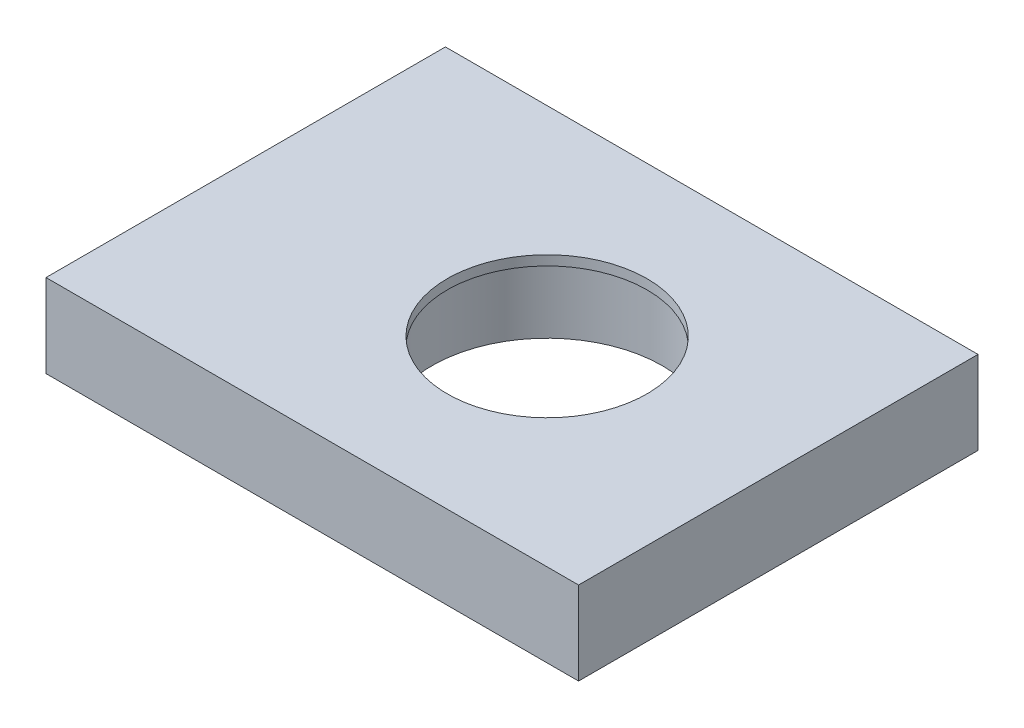
ISO-10303-21;
HEADER;
FILE_DESCRIPTION(('STEP AP214'),'2;1');
FILE_NAME('part.step','',(''),(''),'','','');
FILE_SCHEMA(('AUTOMOTIVE_DESIGN { 1 0 10303 214 1 1 1 1 }'));
ENDSEC;
DATA;
#1=APPLICATION_CONTEXT('core data for automotive mechanical design processes');
#2=APPLICATION_PROTOCOL_DEFINITION('international standard','automotive_design',2000,#1);
#3=PRODUCT_CONTEXT('',#1,'mechanical');
#4=PRODUCT('Part','Part','',(#3));
#5=PRODUCT_RELATED_PRODUCT_CATEGORY('part','',(#4));
#6=PRODUCT_DEFINITION_FORMATION('','',#4);
#7=PRODUCT_DEFINITION_CONTEXT('part definition',#1,'design');
#8=PRODUCT_DEFINITION('design','',#6,#7);
#9=PRODUCT_DEFINITION_SHAPE('','',#8);
#10=(LENGTH_UNIT() NAMED_UNIT(*) SI_UNIT(.MILLI.,.METRE.));
#11=(NAMED_UNIT(*) PLANE_ANGLE_UNIT() SI_UNIT($,.RADIAN.));
#12=(NAMED_UNIT(*) SI_UNIT($,.STERADIAN.) SOLID_ANGLE_UNIT());
#13=UNCERTAINTY_MEASURE_WITH_UNIT(LENGTH_MEASURE(1.E-05),#10,'distance_accuracy_value','');
#14=(GEOMETRIC_REPRESENTATION_CONTEXT(3) GLOBAL_UNCERTAINTY_ASSIGNED_CONTEXT((#13)) GLOBAL_UNIT_ASSIGNED_CONTEXT((#10,
#11,#12)) REPRESENTATION_CONTEXT('',''));
#15=CARTESIAN_POINT('',(0.,0.,0.));
#16=DIRECTION('',(0.,0.,1.));
#17=DIRECTION('',(1.,0.,0.));
#18=AXIS2_PLACEMENT_3D('',#15,#16,#17);
#19=CARTESIAN_POINT('',(3.35279999999999,7.9375,0.));
#20=DIRECTION('',(0.,-1.,0.));
#21=DIRECTION('',(0.,0.,-1.));
#22=AXIS2_PLACEMENT_3D('',#19,#20,#21);
#23=CYLINDRICAL_SURFACE('',#22,9.525);
#24=CARTESIAN_POINT('',(3.35279999999999,7.9375,0.));
#25=DIRECTION('',(0.,-1.,0.));
#26=DIRECTION('',(0.,0.,-1.));
#27=AXIS2_PLACEMENT_3D('',#24,#25,#26);
#28=CIRCLE('',#27,9.525);
#29=CARTESIAN_POINT('',(3.35279999999999,7.9375,-9.525));
#30=VERTEX_POINT('',#29);
#31=EDGE_CURVE('E120',#30,#30,#28,.T.);
#32=ORIENTED_EDGE('',*,*,#31,.F.);
#33=EDGE_LOOP('',(#32));
#34=FACE_BOUND('',#33,.T.);
#35=CARTESIAN_POINT('',(3.35279999999999,7.0104,0.));
#36=DIRECTION('',(0.,-1.,0.));
#37=DIRECTION('',(0.,0.,-1.));
#38=AXIS2_PLACEMENT_3D('',#35,#36,#37);
#39=CIRCLE('',#38,9.525);
#40=CARTESIAN_POINT('',(3.35279999999999,7.0104,-9.525));
#41=VERTEX_POINT('',#40);
#42=EDGE_CURVE('E49',#41,#41,#39,.F.);
#43=ORIENTED_EDGE('',*,*,#42,.F.);
#44=EDGE_LOOP('',(#43));
#45=FACE_BOUND('',#44,.T.);
#46=ADVANCED_FACE('F45',(#34,#45),#23,.F.);
#47=CARTESIAN_POINT('',(25.4,7.9375,19.05));
#48=DIRECTION('',(-1.,0.,0.));
#49=DIRECTION('',(0.,0.,1.));
#50=AXIS2_PLACEMENT_3D('',#47,#48,#49);
#51=PLANE('',#50);
#52=DIRECTION('',(0.,0.,-1.));
#53=VECTOR('',#52,1.);
#54=CARTESIAN_POINT('',(25.4,0.,19.05));
#55=LINE('',#54,#53);
#56=CARTESIAN_POINT('',(25.4,0.,19.05));
#57=VERTEX_POINT('',#56);
#58=CARTESIAN_POINT('',(25.4,0.,-19.05));
#59=VERTEX_POINT('',#58);
#60=EDGE_CURVE('E116',#57,#59,#55,.T.);
#61=ORIENTED_EDGE('',*,*,#60,.T.);
#62=DIRECTION('',(0.,-1.,0.));
#63=VECTOR('',#62,1.);
#64=CARTESIAN_POINT('',(25.4,7.9375,-19.05));
#65=LINE('',#64,#63);
#66=CARTESIAN_POINT('',(25.4,7.9375,-19.05));
#67=VERTEX_POINT('',#66);
#68=EDGE_CURVE('E11',#67,#59,#65,.T.);
#69=ORIENTED_EDGE('',*,*,#68,.F.);
#70=DIRECTION('',(0.,0.,-1.));
#71=VECTOR('',#70,1.);
#72=CARTESIAN_POINT('',(25.4,7.9375,19.05));
#73=LINE('',#72,#71);
#74=CARTESIAN_POINT('',(25.4,7.9375,19.05));
#75=VERTEX_POINT('',#74);
#76=EDGE_CURVE('E99',#75,#67,#73,.T.);
#77=ORIENTED_EDGE('',*,*,#76,.F.);
#78=DIRECTION('',(0.,-1.,0.));
#79=VECTOR('',#78,1.);
#80=CARTESIAN_POINT('',(25.4,7.9375,19.05));
#81=LINE('',#80,#79);
#82=EDGE_CURVE('E112',#75,#57,#81,.T.);
#83=ORIENTED_EDGE('',*,*,#82,.T.);
#84=EDGE_LOOP('',(#61,#69,#77,#83));
#85=FACE_BOUND('',#84,.T.);
#86=ADVANCED_FACE('F47',(#85),#51,.F.);
#87=CARTESIAN_POINT('',(-25.4,7.9375,-19.05));
#88=DIRECTION('',(0.,0.,1.));
#89=DIRECTION('',(1.,0.,0.));
#90=AXIS2_PLACEMENT_3D('',#87,#88,#89);
#91=PLANE('',#90);
#92=DIRECTION('',(-1.,0.,0.));
#93=VECTOR('',#92,1.);
#94=CARTESIAN_POINT('',(-25.4,0.,-19.05));
#95=LINE('',#94,#93);
#96=CARTESIAN_POINT('',(-25.4,0.,-19.05));
#97=VERTEX_POINT('',#96);
#98=EDGE_CURVE('E104',#59,#97,#95,.T.);
#99=ORIENTED_EDGE('',*,*,#98,.T.);
#100=DIRECTION('',(0.,-1.,0.));
#101=VECTOR('',#100,1.);
#102=CARTESIAN_POINT('',(-25.4,7.9375,-19.05));
#103=LINE('',#102,#101);
#104=CARTESIAN_POINT('',(-25.4,7.9375,-19.05));
#105=VERTEX_POINT('',#104);
#106=EDGE_CURVE('E56',#105,#97,#103,.T.);
#107=ORIENTED_EDGE('',*,*,#106,.F.);
#108=DIRECTION('',(-1.,0.,0.));
#109=VECTOR('',#108,1.);
#110=CARTESIAN_POINT('',(-25.4,7.9375,-19.05));
#111=LINE('',#110,#109);
#112=EDGE_CURVE('E94',#67,#105,#111,.T.);
#113=ORIENTED_EDGE('',*,*,#112,.F.);
#114=ORIENTED_EDGE('',*,*,#68,.T.);
#115=EDGE_LOOP('',(#99,#107,#113,#114));
#116=FACE_BOUND('',#115,.T.);
#117=ADVANCED_FACE('F103',(#116),#91,.F.);
#118=CARTESIAN_POINT('',(-25.4,7.9375,19.05));
#119=DIRECTION('',(1.,0.,0.));
#120=DIRECTION('',(0.,0.,-1.));
#121=AXIS2_PLACEMENT_3D('',#118,#119,#120);
#122=PLANE('',#121);
#123=DIRECTION('',(0.,0.,1.));
#124=VECTOR('',#123,1.);
#125=CARTESIAN_POINT('',(-25.4,0.,19.05));
#126=LINE('',#125,#124);
#127=CARTESIAN_POINT('',(-25.4,0.,19.05));
#128=VERTEX_POINT('',#127);
#129=EDGE_CURVE('E81',#97,#128,#126,.T.);
#130=ORIENTED_EDGE('',*,*,#129,.T.);
#131=DIRECTION('',(0.,-1.,0.));
#132=VECTOR('',#131,1.);
#133=CARTESIAN_POINT('',(-25.4,7.9375,19.05));
#134=LINE('',#133,#132);
#135=CARTESIAN_POINT('',(-25.4,7.9375,19.05));
#136=VERTEX_POINT('',#135);
#137=EDGE_CURVE('E106',#136,#128,#134,.T.);
#138=ORIENTED_EDGE('',*,*,#137,.F.);
#139=DIRECTION('',(0.,0.,1.));
#140=VECTOR('',#139,1.);
#141=CARTESIAN_POINT('',(-25.4,7.9375,19.05));
#142=LINE('',#141,#140);
#143=EDGE_CURVE('E97',#105,#136,#142,.T.);
#144=ORIENTED_EDGE('',*,*,#143,.F.);
#145=ORIENTED_EDGE('',*,*,#106,.T.);
#146=EDGE_LOOP('',(#130,#138,#144,#145));
#147=FACE_BOUND('',#146,.T.);
#148=ADVANCED_FACE('F108',(#147),#122,.F.);
#149=CARTESIAN_POINT('',(-25.4,7.9375,19.05));
#150=DIRECTION('',(0.,0.,-1.));
#151=DIRECTION('',(-1.,0.,0.));
#152=AXIS2_PLACEMENT_3D('',#149,#150,#151);
#153=PLANE('',#152);
#154=DIRECTION('',(1.,0.,0.));
#155=VECTOR('',#154,1.);
#156=CARTESIAN_POINT('',(-25.4,0.,19.05));
#157=LINE('',#156,#155);
#158=EDGE_CURVE('E87',#128,#57,#157,.T.);
#159=ORIENTED_EDGE('',*,*,#158,.T.);
#160=ORIENTED_EDGE('',*,*,#82,.F.);
#161=DIRECTION('',(1.,0.,0.));
#162=VECTOR('',#161,1.);
#163=CARTESIAN_POINT('',(-25.4,7.9375,19.05));
#164=LINE('',#163,#162);
#165=EDGE_CURVE('E64',#136,#75,#164,.T.);
#166=ORIENTED_EDGE('',*,*,#165,.F.);
#167=ORIENTED_EDGE('',*,*,#137,.T.);
#168=EDGE_LOOP('',(#159,#160,#166,#167));
#169=FACE_BOUND('',#168,.T.);
#170=ADVANCED_FACE('F130',(#169),#153,.F.);
#171=CARTESIAN_POINT('',(0.,7.9375,0.));
#172=DIRECTION('',(0.,-1.,0.));
#173=DIRECTION('',(0.,0.,-1.));
#174=AXIS2_PLACEMENT_3D('',#171,#172,#173);
#175=PLANE('',#174);
#176=ORIENTED_EDGE('',*,*,#31,.T.);
#177=EDGE_LOOP('',(#176));
#178=FACE_BOUND('',#177,.T.);
#179=ORIENTED_EDGE('',*,*,#76,.T.);
#180=ORIENTED_EDGE('',*,*,#112,.T.);
#181=ORIENTED_EDGE('',*,*,#143,.T.);
#182=ORIENTED_EDGE('',*,*,#165,.T.);
#183=EDGE_LOOP('',(#179,#180,#181,#182));
#184=FACE_BOUND('',#183,.T.);
#185=ADVANCED_FACE('F95',(#178,#184),#175,.F.);
#186=CARTESIAN_POINT('',(0.,0.,0.));
#187=DIRECTION('',(0.,-1.,0.));
#188=DIRECTION('',(0.,0.,-1.));
#189=AXIS2_PLACEMENT_3D('',#186,#187,#188);
#190=PLANE('',#189);
#191=CARTESIAN_POINT('',(-21.4249,0.,14.986));
#192=DIRECTION('',(0.,-1.,0.));
#193=DIRECTION('',(0.,0.,-1.));
#194=AXIS2_PLACEMENT_3D('',#191,#192,#193);
#195=CIRCLE('',#194,1.4986);
#196=CARTESIAN_POINT('',(-21.4249,0.,13.4874));
#197=VERTEX_POINT('',#196);
#198=EDGE_CURVE('E166',#197,#197,#195,.T.);
#199=ORIENTED_EDGE('',*,*,#198,.F.);
#200=EDGE_LOOP('',(#199));
#201=FACE_BOUND('',#200,.T.);
#202=CARTESIAN_POINT('',(-21.4249,0.,-4.99533333333333));
#203=DIRECTION('',(0.,-1.,0.));
#204=DIRECTION('',(0.,0.,-1.));
#205=AXIS2_PLACEMENT_3D('',#202,#203,#204);
#206=CIRCLE('',#205,1.4986);
#207=CARTESIAN_POINT('',(-21.4249,0.,-6.49393333333333));
#208=VERTEX_POINT('',#207);
#209=EDGE_CURVE('E154',#208,#208,#206,.T.);
#210=ORIENTED_EDGE('',*,*,#209,.F.);
#211=EDGE_LOOP('',(#210));
#212=FACE_BOUND('',#211,.T.);
#213=CARTESIAN_POINT('',(-21.4249,0.,-14.986));
#214=DIRECTION('',(0.,-1.,0.));
#215=DIRECTION('',(0.,0.,-1.));
#216=AXIS2_PLACEMENT_3D('',#213,#214,#215);
#217=CIRCLE('',#216,1.4986);
#218=CARTESIAN_POINT('',(-21.4249,0.,-16.4846));
#219=VERTEX_POINT('',#218);
#220=EDGE_CURVE('E153',#219,#219,#217,.T.);
#221=ORIENTED_EDGE('',*,*,#220,.F.);
#222=EDGE_LOOP('',(#221));
#223=FACE_BOUND('',#222,.T.);
#224=CARTESIAN_POINT('',(-21.4249,0.,4.99533333333334));
#225=DIRECTION('',(0.,-1.,0.));
#226=DIRECTION('',(0.,0.,-1.));
#227=AXIS2_PLACEMENT_3D('',#224,#225,#226);
#228=CIRCLE('',#227,1.4986);
#229=CARTESIAN_POINT('',(-21.4249,0.,3.49673333333334));
#230=VERTEX_POINT('',#229);
#231=EDGE_CURVE('E162',#230,#230,#228,.T.);
#232=ORIENTED_EDGE('',*,*,#231,.F.);
#233=EDGE_LOOP('',(#232));
#234=FACE_BOUND('',#233,.T.);
#235=CARTESIAN_POINT('',(3.35279999999999,0.,0.));
#236=DIRECTION('',(0.,-1.,0.));
#237=DIRECTION('',(0.,0.,-1.));
#238=AXIS2_PLACEMENT_3D('',#235,#236,#237);
#239=CIRCLE('',#238,10.9982);
#240=CARTESIAN_POINT('',(3.35279999999999,0.,-10.9982));
#241=VERTEX_POINT('',#240);
#242=EDGE_CURVE('E140',#241,#241,#239,.T.);
#243=ORIENTED_EDGE('',*,*,#242,.F.);
#244=EDGE_LOOP('',(#243));
#245=FACE_BOUND('',#244,.T.);
#246=ORIENTED_EDGE('',*,*,#60,.F.);
#247=ORIENTED_EDGE('',*,*,#158,.F.);
#248=ORIENTED_EDGE('',*,*,#129,.F.);
#249=ORIENTED_EDGE('',*,*,#98,.F.);
#250=EDGE_LOOP('',(#246,#247,#248,#249));
#251=FACE_BOUND('',#250,.T.);
#252=ADVANCED_FACE('F133',(#201,#212,#223,#234,#245,#251),#190,.T.);
#253=CARTESIAN_POINT('',(3.35279999999999,7.0104,0.));
#254=DIRECTION('',(0.,-1.,0.));
#255=DIRECTION('',(0.,0.,-1.));
#256=AXIS2_PLACEMENT_3D('',#253,#254,#255);
#257=PLANE('',#256);
#258=CARTESIAN_POINT('',(3.35279999999999,7.0104,0.));
#259=DIRECTION('',(0.,-1.,0.));
#260=DIRECTION('',(0.,0.,-1.));
#261=AXIS2_PLACEMENT_3D('',#258,#259,#260);
#262=CIRCLE('',#261,10.9982);
#263=CARTESIAN_POINT('',(3.35279999999999,7.0104,-10.9982));
#264=VERTEX_POINT('',#263);
#265=EDGE_CURVE('E144',#264,#264,#262,.T.);
#266=ORIENTED_EDGE('',*,*,#265,.T.);
#267=EDGE_LOOP('',(#266));
#268=FACE_BOUND('',#267,.T.);
#269=ORIENTED_EDGE('',*,*,#42,.T.);
#270=EDGE_LOOP('',(#269));
#271=FACE_BOUND('',#270,.T.);
#272=ADVANCED_FACE('F192',(#268,#271),#257,.T.);
#273=CARTESIAN_POINT('',(3.35279999999999,7.0104,0.));
#274=DIRECTION('',(0.,-1.,0.));
#275=DIRECTION('',(0.,0.,-1.));
#276=AXIS2_PLACEMENT_3D('',#273,#274,#275);
#277=CYLINDRICAL_SURFACE('',#276,10.9982);
#278=ORIENTED_EDGE('',*,*,#265,.F.);
#279=EDGE_LOOP('',(#278));
#280=FACE_BOUND('',#279,.T.);
#281=ORIENTED_EDGE('',*,*,#242,.T.);
#282=EDGE_LOOP('',(#281));
#283=FACE_BOUND('',#282,.T.);
#284=ADVANCED_FACE('F202',(#280,#283),#277,.F.);
#285=CARTESIAN_POINT('',(-21.4249,6.5,4.99533333333334));
#286=DIRECTION('',(0.,-1.,0.));
#287=DIRECTION('',(0.,0.,-1.));
#288=AXIS2_PLACEMENT_3D('',#285,#286,#287);
#289=CYLINDRICAL_SURFACE('',#288,1.4986);
#290=CARTESIAN_POINT('',(-21.4249,6.5,4.99533333333334));
#291=DIRECTION('',(0.,-1.,0.));
#292=DIRECTION('',(0.,0.,-1.));
#293=AXIS2_PLACEMENT_3D('',#290,#291,#292);
#294=CIRCLE('',#293,1.4986);
#295=CARTESIAN_POINT('',(-21.4249,6.5,3.49673333333334));
#296=VERTEX_POINT('',#295);
#297=EDGE_CURVE('E158',#296,#296,#294,.T.);
#298=CARTESIAN_POINT('',(-21.4249,6.5,3.49673333333334));
#299=CARTESIAN_POINT('',(-21.4249,6.43229166666667,3.49673333333334));
#300=CARTESIAN_POINT('',(-21.4249,6.36458333333333,3.49673333333334));
#301=CARTESIAN_POINT('',(-21.4249,6.22916666666667,3.49673333333334));
#302=CARTESIAN_POINT('',(-21.4249,6.16145833333333,3.49673333333334));
#303=CARTESIAN_POINT('',(-21.4249,6.02604166666667,3.49673333333334));
#304=CARTESIAN_POINT('',(-21.4249,5.95833333333333,3.49673333333334));
#305=CARTESIAN_POINT('',(-21.4249,5.82291666666667,3.49673333333334));
#306=CARTESIAN_POINT('',(-21.4249,5.75520833333333,3.49673333333334));
#307=CARTESIAN_POINT('',(-21.4249,5.61979166666667,3.49673333333334));
#308=CARTESIAN_POINT('',(-21.4249,5.55208333333333,3.49673333333334));
#309=CARTESIAN_POINT('',(-21.4249,5.41666666666667,3.49673333333334));
#310=CARTESIAN_POINT('',(-21.4249,5.34895833333333,3.49673333333334));
#311=CARTESIAN_POINT('',(-21.4249,5.21354166666667,3.49673333333334));
#312=CARTESIAN_POINT('',(-21.4249,5.14583333333333,3.49673333333334));
#313=CARTESIAN_POINT('',(-21.4249,5.01041666666667,3.49673333333334));
#314=CARTESIAN_POINT('',(-21.4249,4.94270833333333,3.49673333333334));
#315=CARTESIAN_POINT('',(-21.4249,4.80729166666667,3.49673333333334));
#316=CARTESIAN_POINT('',(-21.4249,4.73958333333333,3.49673333333334));
#317=CARTESIAN_POINT('',(-21.4249,4.60416666666667,3.49673333333334));
#318=CARTESIAN_POINT('',(-21.4249,4.53645833333333,3.49673333333334));
#319=CARTESIAN_POINT('',(-21.4249,4.40104166666667,3.49673333333334));
#320=CARTESIAN_POINT('',(-21.4249,4.33333333333333,3.49673333333334));
#321=CARTESIAN_POINT('',(-21.4249,4.19791666666667,3.49673333333334));
#322=CARTESIAN_POINT('',(-21.4249,4.13020833333333,3.49673333333334));
#323=CARTESIAN_POINT('',(-21.4249,3.99479166666667,3.49673333333334));
#324=CARTESIAN_POINT('',(-21.4249,3.92708333333333,3.49673333333334));
#325=CARTESIAN_POINT('',(-21.4249,3.79166666666667,3.49673333333334));
#326=CARTESIAN_POINT('',(-21.4249,3.72395833333333,3.49673333333334));
#327=CARTESIAN_POINT('',(-21.4249,3.58854166666667,3.49673333333334));
#328=CARTESIAN_POINT('',(-21.4249,3.52083333333333,3.49673333333334));
#329=CARTESIAN_POINT('',(-21.4249,3.38541666666667,3.49673333333334));
#330=CARTESIAN_POINT('',(-21.4249,3.31770833333333,3.49673333333334));
#331=CARTESIAN_POINT('',(-21.4249,3.18229166666667,3.49673333333334));
#332=CARTESIAN_POINT('',(-21.4249,3.11458333333333,3.49673333333334));
#333=CARTESIAN_POINT('',(-21.4249,2.97916666666667,3.49673333333334));
#334=CARTESIAN_POINT('',(-21.4249,2.91145833333333,3.49673333333334));
#335=CARTESIAN_POINT('',(-21.4249,2.77604166666667,3.49673333333334));
#336=CARTESIAN_POINT('',(-21.4249,2.70833333333333,3.49673333333334));
#337=CARTESIAN_POINT('',(-21.4249,2.57291666666667,3.49673333333334));
#338=CARTESIAN_POINT('',(-21.4249,2.50520833333333,3.49673333333334));
#339=CARTESIAN_POINT('',(-21.4249,2.36979166666667,3.49673333333334));
#340=CARTESIAN_POINT('',(-21.4249,2.30208333333333,3.49673333333334));
#341=CARTESIAN_POINT('',(-21.4249,2.16666666666667,3.49673333333334));
#342=CARTESIAN_POINT('',(-21.4249,2.09895833333333,3.49673333333334));
#343=CARTESIAN_POINT('',(-21.4249,1.96354166666667,3.49673333333334));
#344=CARTESIAN_POINT('',(-21.4249,1.89583333333333,3.49673333333334));
#345=CARTESIAN_POINT('',(-21.4249,1.76041666666667,3.49673333333334));
#346=CARTESIAN_POINT('',(-21.4249,1.69270833333333,3.49673333333334));
#347=CARTESIAN_POINT('',(-21.4249,1.55729166666667,3.49673333333334));
#348=CARTESIAN_POINT('',(-21.4249,1.48958333333333,3.49673333333334));
#349=CARTESIAN_POINT('',(-21.4249,1.35416666666667,3.49673333333334));
#350=CARTESIAN_POINT('',(-21.4249,1.28645833333333,3.49673333333334));
#351=CARTESIAN_POINT('',(-21.4249,1.15104166666667,3.49673333333334));
#352=CARTESIAN_POINT('',(-21.4249,1.08333333333333,3.49673333333334));
#353=CARTESIAN_POINT('',(-21.4249,0.947916666666667,3.49673333333334));
#354=CARTESIAN_POINT('',(-21.4249,0.880208333333333,3.49673333333334));
#355=CARTESIAN_POINT('',(-21.4249,0.744791666666667,3.49673333333334));
#356=CARTESIAN_POINT('',(-21.4249,0.677083333333334,3.49673333333334));
#357=CARTESIAN_POINT('',(-21.4249,0.541666666666667,3.49673333333334));
#358=CARTESIAN_POINT('',(-21.4249,0.473958333333334,3.49673333333334));
#359=CARTESIAN_POINT('',(-21.4249,0.338541666666667,3.49673333333334));
#360=CARTESIAN_POINT('',(-21.4249,0.270833333333334,3.49673333333334));
#361=CARTESIAN_POINT('',(-21.4249,0.135416666666667,3.49673333333334));
#362=CARTESIAN_POINT('',(-21.4249,0.0677083333333333,3.49673333333334));
#363=CARTESIAN_POINT('',(-21.4249,0.,3.49673333333334));
#364=B_SPLINE_CURVE_WITH_KNOTS('',3,(#298,#299,#300,#301,#302,#303,#304,#305,#306,#307,#308,
#309,#310,#311,#312,#313,#314,#315,#316,#317,#318,#319,#320,#321,#322,#323,#324,#325,#326,#327,
#328,#329,#330,#331,#332,#333,#334,#335,#336,#337,#338,#339,#340,#341,#342,#343,#344,#345,#346,
#347,#348,#349,#350,#351,#352,#353,#354,#355,#356,#357,#358,#359,#360,#361,#362,#363),
.UNSPECIFIED.,.F.,.F.,(4,2,2,2,2,2,2,2,2,2,2,2,2,2,2,2,2,2,2,2,2,2,2,2,2,2,2,2,2,2,2,2,4),(0.,
0.203125,0.40625,0.609375000000001,0.812500000000001,1.015625,1.21875,1.421875,1.625,1.828125,
2.03125,2.234375,2.4375,2.640625,2.84375,3.046875,3.25,3.453125,3.65625,3.859375,4.0625,
4.265625,4.46875,4.671875,4.875,5.078125,5.28125,5.484375,5.6875,5.890625,6.09375,6.296875,6.5),.UNSPECIFIED.);
#365=EDGE_CURVE('BSEAM204',#296,#230,#364,.T.);
#366=ORIENTED_EDGE('',*,*,#297,.F.);
#367=ORIENTED_EDGE('',*,*,#231,.T.);
#368=ORIENTED_EDGE('',*,*,#365,.T.);
#369=ORIENTED_EDGE('',*,*,#365,.F.);
#370=EDGE_LOOP('',(#366,#368,#367,#369));
#371=FACE_BOUND('',#370,.T.);
#372=ADVANCED_FACE('F204',(#371),#289,.F.);
#373=CARTESIAN_POINT('',(-21.4249,6.5,4.99533333333334));
#374=DIRECTION('',(0.,-1.,0.));
#375=DIRECTION('',(0.,0.,-1.));
#376=AXIS2_PLACEMENT_3D('',#373,#374,#375);
#377=PLANE('',#376);
#378=ORIENTED_EDGE('',*,*,#297,.T.);
#379=EDGE_LOOP('',(#378));
#380=FACE_BOUND('',#379,.T.);
#381=ADVANCED_FACE('F211',(#380),#377,.T.);
#382=CARTESIAN_POINT('',(-21.4249,6.5,-14.986));
#383=DIRECTION('',(0.,-1.,0.));
#384=DIRECTION('',(0.,0.,-1.));
#385=AXIS2_PLACEMENT_3D('',#382,#383,#384);
#386=CYLINDRICAL_SURFACE('',#385,1.4986);
#387=CARTESIAN_POINT('',(-21.4249,6.5,-14.986));
#388=DIRECTION('',(0.,-1.,0.));
#389=DIRECTION('',(0.,0.,-1.));
#390=AXIS2_PLACEMENT_3D('',#387,#388,#389);
#391=CIRCLE('',#390,1.4986);
#392=CARTESIAN_POINT('',(-21.4249,6.5,-16.4846));
#393=VERTEX_POINT('',#392);
#394=EDGE_CURVE('E149',#393,#393,#391,.T.);
#395=CARTESIAN_POINT('',(-21.4249,6.5,-16.4846));
#396=CARTESIAN_POINT('',(-21.4249,6.43229166666667,-16.4846));
#397=CARTESIAN_POINT('',(-21.4249,6.36458333333333,-16.4846));
#398=CARTESIAN_POINT('',(-21.4249,6.22916666666667,-16.4846));
#399=CARTESIAN_POINT('',(-21.4249,6.16145833333333,-16.4846));
#400=CARTESIAN_POINT('',(-21.4249,6.02604166666667,-16.4846));
#401=CARTESIAN_POINT('',(-21.4249,5.95833333333333,-16.4846));
#402=CARTESIAN_POINT('',(-21.4249,5.82291666666667,-16.4846));
#403=CARTESIAN_POINT('',(-21.4249,5.75520833333333,-16.4846));
#404=CARTESIAN_POINT('',(-21.4249,5.61979166666667,-16.4846));
#405=CARTESIAN_POINT('',(-21.4249,5.55208333333333,-16.4846));
#406=CARTESIAN_POINT('',(-21.4249,5.41666666666667,-16.4846));
#407=CARTESIAN_POINT('',(-21.4249,5.34895833333333,-16.4846));
#408=CARTESIAN_POINT('',(-21.4249,5.21354166666667,-16.4846));
#409=CARTESIAN_POINT('',(-21.4249,5.14583333333333,-16.4846));
#410=CARTESIAN_POINT('',(-21.4249,5.01041666666667,-16.4846));
#411=CARTESIAN_POINT('',(-21.4249,4.94270833333333,-16.4846));
#412=CARTESIAN_POINT('',(-21.4249,4.80729166666667,-16.4846));
#413=CARTESIAN_POINT('',(-21.4249,4.73958333333333,-16.4846));
#414=CARTESIAN_POINT('',(-21.4249,4.60416666666667,-16.4846));
#415=CARTESIAN_POINT('',(-21.4249,4.53645833333333,-16.4846));
#416=CARTESIAN_POINT('',(-21.4249,4.40104166666667,-16.4846));
#417=CARTESIAN_POINT('',(-21.4249,4.33333333333333,-16.4846));
#418=CARTESIAN_POINT('',(-21.4249,4.19791666666667,-16.4846));
#419=CARTESIAN_POINT('',(-21.4249,4.13020833333333,-16.4846));
#420=CARTESIAN_POINT('',(-21.4249,3.99479166666667,-16.4846));
#421=CARTESIAN_POINT('',(-21.4249,3.92708333333333,-16.4846));
#422=CARTESIAN_POINT('',(-21.4249,3.79166666666667,-16.4846));
#423=CARTESIAN_POINT('',(-21.4249,3.72395833333333,-16.4846));
#424=CARTESIAN_POINT('',(-21.4249,3.58854166666667,-16.4846));
#425=CARTESIAN_POINT('',(-21.4249,3.52083333333333,-16.4846));
#426=CARTESIAN_POINT('',(-21.4249,3.38541666666667,-16.4846));
#427=CARTESIAN_POINT('',(-21.4249,3.31770833333333,-16.4846));
#428=CARTESIAN_POINT('',(-21.4249,3.18229166666667,-16.4846));
#429=CARTESIAN_POINT('',(-21.4249,3.11458333333333,-16.4846));
#430=CARTESIAN_POINT('',(-21.4249,2.97916666666667,-16.4846));
#431=CARTESIAN_POINT('',(-21.4249,2.91145833333333,-16.4846));
#432=CARTESIAN_POINT('',(-21.4249,2.77604166666667,-16.4846));
#433=CARTESIAN_POINT('',(-21.4249,2.70833333333333,-16.4846));
#434=CARTESIAN_POINT('',(-21.4249,2.57291666666667,-16.4846));
#435=CARTESIAN_POINT('',(-21.4249,2.50520833333333,-16.4846));
#436=CARTESIAN_POINT('',(-21.4249,2.36979166666667,-16.4846));
#437=CARTESIAN_POINT('',(-21.4249,2.30208333333333,-16.4846));
#438=CARTESIAN_POINT('',(-21.4249,2.16666666666667,-16.4846));
#439=CARTESIAN_POINT('',(-21.4249,2.09895833333333,-16.4846));
#440=CARTESIAN_POINT('',(-21.4249,1.96354166666667,-16.4846));
#441=CARTESIAN_POINT('',(-21.4249,1.89583333333333,-16.4846));
#442=CARTESIAN_POINT('',(-21.4249,1.76041666666667,-16.4846));
#443=CARTESIAN_POINT('',(-21.4249,1.69270833333333,-16.4846));
#444=CARTESIAN_POINT('',(-21.4249,1.55729166666667,-16.4846));
#445=CARTESIAN_POINT('',(-21.4249,1.48958333333333,-16.4846));
#446=CARTESIAN_POINT('',(-21.4249,1.35416666666667,-16.4846));
#447=CARTESIAN_POINT('',(-21.4249,1.28645833333333,-16.4846));
#448=CARTESIAN_POINT('',(-21.4249,1.15104166666667,-16.4846));
#449=CARTESIAN_POINT('',(-21.4249,1.08333333333333,-16.4846));
#450=CARTESIAN_POINT('',(-21.4249,0.947916666666667,-16.4846));
#451=CARTESIAN_POINT('',(-21.4249,0.880208333333333,-16.4846));
#452=CARTESIAN_POINT('',(-21.4249,0.744791666666667,-16.4846));
#453=CARTESIAN_POINT('',(-21.4249,0.677083333333334,-16.4846));
#454=CARTESIAN_POINT('',(-21.4249,0.541666666666667,-16.4846));
#455=CARTESIAN_POINT('',(-21.4249,0.473958333333334,-16.4846));
#456=CARTESIAN_POINT('',(-21.4249,0.338541666666667,-16.4846));
#457=CARTESIAN_POINT('',(-21.4249,0.270833333333334,-16.4846));
#458=CARTESIAN_POINT('',(-21.4249,0.135416666666667,-16.4846));
#459=CARTESIAN_POINT('',(-21.4249,0.0677083333333333,-16.4846));
#460=CARTESIAN_POINT('',(-21.4249,0.,-16.4846));
#461=B_SPLINE_CURVE_WITH_KNOTS('',3,(#395,#396,#397,#398,#399,#400,#401,#402,#403,#404,#405,
#406,#407,#408,#409,#410,#411,#412,#413,#414,#415,#416,#417,#418,#419,#420,#421,#422,#423,#424,
#425,#426,#427,#428,#429,#430,#431,#432,#433,#434,#435,#436,#437,#438,#439,#440,#441,#442,#443,
#444,#445,#446,#447,#448,#449,#450,#451,#452,#453,#454,#455,#456,#457,#458,#459,#460),
.UNSPECIFIED.,.F.,.F.,(4,2,2,2,2,2,2,2,2,2,2,2,2,2,2,2,2,2,2,2,2,2,2,2,2,2,2,2,2,2,2,2,4),(0.,
0.203125,0.40625,0.609375000000001,0.812500000000001,1.015625,1.21875,1.421875,1.625,1.828125,
2.03125,2.234375,2.4375,2.640625,2.84375,3.046875,3.25,3.453125,3.65625,3.859375,4.0625,
4.265625,4.46875,4.671875,4.875,5.078125,5.28125,5.484375,5.6875,5.890625,6.09375,6.296875,6.5),.UNSPECIFIED.);
#462=EDGE_CURVE('BSEAM288',#393,#219,#461,.T.);
#463=ORIENTED_EDGE('',*,*,#394,.F.);
#464=ORIENTED_EDGE('',*,*,#220,.T.);
#465=ORIENTED_EDGE('',*,*,#462,.T.);
#466=ORIENTED_EDGE('',*,*,#462,.F.);
#467=EDGE_LOOP('',(#463,#465,#464,#466));
#468=FACE_BOUND('',#467,.T.);
#469=ADVANCED_FACE('F288',(#468),#386,.F.);
#470=CARTESIAN_POINT('',(-21.4249,6.5,-14.986));
#471=DIRECTION('',(0.,-1.,0.));
#472=DIRECTION('',(0.,0.,-1.));
#473=AXIS2_PLACEMENT_3D('',#470,#471,#472);
#474=PLANE('',#473);
#475=ORIENTED_EDGE('',*,*,#394,.T.);
#476=EDGE_LOOP('',(#475));
#477=FACE_BOUND('',#476,.T.);
#478=ADVANCED_FACE('F298',(#477),#474,.T.);
#479=CARTESIAN_POINT('',(-21.4249,6.5,-4.99533333333333));
#480=DIRECTION('',(0.,-1.,0.));
#481=DIRECTION('',(0.,0.,-1.));
#482=AXIS2_PLACEMENT_3D('',#479,#480,#481);
#483=CYLINDRICAL_SURFACE('',#482,1.4986);
#484=CARTESIAN_POINT('',(-21.4249,6.5,-4.99533333333333));
#485=DIRECTION('',(0.,-1.,0.));
#486=DIRECTION('',(0.,0.,-1.));
#487=AXIS2_PLACEMENT_3D('',#484,#485,#486);
#488=CIRCLE('',#487,1.4986);
#489=CARTESIAN_POINT('',(-21.4249,6.5,-6.49393333333333));
#490=VERTEX_POINT('',#489);
#491=EDGE_CURVE('E167',#490,#490,#488,.T.);
#492=CARTESIAN_POINT('',(-21.4249,6.5,-6.49393333333333));
#493=CARTESIAN_POINT('',(-21.4249,6.43229166666667,-6.49393333333333));
#494=CARTESIAN_POINT('',(-21.4249,6.36458333333333,-6.49393333333333));
#495=CARTESIAN_POINT('',(-21.4249,6.22916666666667,-6.49393333333333));
#496=CARTESIAN_POINT('',(-21.4249,6.16145833333333,-6.49393333333333));
#497=CARTESIAN_POINT('',(-21.4249,6.02604166666667,-6.49393333333333));
#498=CARTESIAN_POINT('',(-21.4249,5.95833333333333,-6.49393333333333));
#499=CARTESIAN_POINT('',(-21.4249,5.82291666666667,-6.49393333333333));
#500=CARTESIAN_POINT('',(-21.4249,5.75520833333333,-6.49393333333333));
#501=CARTESIAN_POINT('',(-21.4249,5.61979166666667,-6.49393333333333));
#502=CARTESIAN_POINT('',(-21.4249,5.55208333333333,-6.49393333333333));
#503=CARTESIAN_POINT('',(-21.4249,5.41666666666667,-6.49393333333333));
#504=CARTESIAN_POINT('',(-21.4249,5.34895833333333,-6.49393333333333));
#505=CARTESIAN_POINT('',(-21.4249,5.21354166666667,-6.49393333333333));
#506=CARTESIAN_POINT('',(-21.4249,5.14583333333333,-6.49393333333333));
#507=CARTESIAN_POINT('',(-21.4249,5.01041666666667,-6.49393333333333));
#508=CARTESIAN_POINT('',(-21.4249,4.94270833333333,-6.49393333333333));
#509=CARTESIAN_POINT('',(-21.4249,4.80729166666667,-6.49393333333333));
#510=CARTESIAN_POINT('',(-21.4249,4.73958333333333,-6.49393333333333));
#511=CARTESIAN_POINT('',(-21.4249,4.60416666666667,-6.49393333333333));
#512=CARTESIAN_POINT('',(-21.4249,4.53645833333333,-6.49393333333333));
#513=CARTESIAN_POINT('',(-21.4249,4.40104166666667,-6.49393333333333));
#514=CARTESIAN_POINT('',(-21.4249,4.33333333333333,-6.49393333333333));
#515=CARTESIAN_POINT('',(-21.4249,4.19791666666667,-6.49393333333333));
#516=CARTESIAN_POINT('',(-21.4249,4.13020833333333,-6.49393333333333));
#517=CARTESIAN_POINT('',(-21.4249,3.99479166666667,-6.49393333333333));
#518=CARTESIAN_POINT('',(-21.4249,3.92708333333333,-6.49393333333333));
#519=CARTESIAN_POINT('',(-21.4249,3.79166666666667,-6.49393333333333));
#520=CARTESIAN_POINT('',(-21.4249,3.72395833333333,-6.49393333333333));
#521=CARTESIAN_POINT('',(-21.4249,3.58854166666667,-6.49393333333333));
#522=CARTESIAN_POINT('',(-21.4249,3.52083333333333,-6.49393333333333));
#523=CARTESIAN_POINT('',(-21.4249,3.38541666666667,-6.49393333333333));
#524=CARTESIAN_POINT('',(-21.4249,3.31770833333333,-6.49393333333333));
#525=CARTESIAN_POINT('',(-21.4249,3.18229166666667,-6.49393333333333));
#526=CARTESIAN_POINT('',(-21.4249,3.11458333333333,-6.49393333333333));
#527=CARTESIAN_POINT('',(-21.4249,2.97916666666667,-6.49393333333333));
#528=CARTESIAN_POINT('',(-21.4249,2.91145833333333,-6.49393333333333));
#529=CARTESIAN_POINT('',(-21.4249,2.77604166666667,-6.49393333333333));
#530=CARTESIAN_POINT('',(-21.4249,2.70833333333333,-6.49393333333333));
#531=CARTESIAN_POINT('',(-21.4249,2.57291666666667,-6.49393333333333));
#532=CARTESIAN_POINT('',(-21.4249,2.50520833333333,-6.49393333333333));
#533=CARTESIAN_POINT('',(-21.4249,2.36979166666667,-6.49393333333333));
#534=CARTESIAN_POINT('',(-21.4249,2.30208333333333,-6.49393333333333));
#535=CARTESIAN_POINT('',(-21.4249,2.16666666666667,-6.49393333333333));
#536=CARTESIAN_POINT('',(-21.4249,2.09895833333333,-6.49393333333333));
#537=CARTESIAN_POINT('',(-21.4249,1.96354166666667,-6.49393333333333));
#538=CARTESIAN_POINT('',(-21.4249,1.89583333333333,-6.49393333333333));
#539=CARTESIAN_POINT('',(-21.4249,1.76041666666667,-6.49393333333333));
#540=CARTESIAN_POINT('',(-21.4249,1.69270833333333,-6.49393333333333));
#541=CARTESIAN_POINT('',(-21.4249,1.55729166666667,-6.49393333333333));
#542=CARTESIAN_POINT('',(-21.4249,1.48958333333333,-6.49393333333333));
#543=CARTESIAN_POINT('',(-21.4249,1.35416666666667,-6.49393333333333));
#544=CARTESIAN_POINT('',(-21.4249,1.28645833333333,-6.49393333333333));
#545=CARTESIAN_POINT('',(-21.4249,1.15104166666667,-6.49393333333333));
#546=CARTESIAN_POINT('',(-21.4249,1.08333333333333,-6.49393333333333));
#547=CARTESIAN_POINT('',(-21.4249,0.947916666666667,-6.49393333333333));
#548=CARTESIAN_POINT('',(-21.4249,0.880208333333333,-6.49393333333333));
#549=CARTESIAN_POINT('',(-21.4249,0.744791666666667,-6.49393333333333));
#550=CARTESIAN_POINT('',(-21.4249,0.677083333333334,-6.49393333333333));
#551=CARTESIAN_POINT('',(-21.4249,0.541666666666667,-6.49393333333333));
#552=CARTESIAN_POINT('',(-21.4249,0.473958333333334,-6.49393333333333));
#553=CARTESIAN_POINT('',(-21.4249,0.338541666666667,-6.49393333333333));
#554=CARTESIAN_POINT('',(-21.4249,0.270833333333334,-6.49393333333333));
#555=CARTESIAN_POINT('',(-21.4249,0.135416666666667,-6.49393333333333));
#556=CARTESIAN_POINT('',(-21.4249,0.0677083333333333,-6.49393333333333));
#557=CARTESIAN_POINT('',(-21.4249,0.,-6.49393333333333));
#558=B_SPLINE_CURVE_WITH_KNOTS('',3,(#492,#493,#494,#495,#496,#497,#498,#499,#500,#501,#502,
#503,#504,#505,#506,#507,#508,#509,#510,#511,#512,#513,#514,#515,#516,#517,#518,#519,#520,#521,
#522,#523,#524,#525,#526,#527,#528,#529,#530,#531,#532,#533,#534,#535,#536,#537,#538,#539,#540,
#541,#542,#543,#544,#545,#546,#547,#548,#549,#550,#551,#552,#553,#554,#555,#556,#557),
.UNSPECIFIED.,.F.,.F.,(4,2,2,2,2,2,2,2,2,2,2,2,2,2,2,2,2,2,2,2,2,2,2,2,2,2,2,2,2,2,2,2,4),(0.,
0.203125,0.40625,0.609375000000001,0.812500000000001,1.015625,1.21875,1.421875,1.625,1.828125,
2.03125,2.234375,2.4375,2.640625,2.84375,3.046875,3.25,3.453125,3.65625,3.859375,4.0625,
4.265625,4.46875,4.671875,4.875,5.078125,5.28125,5.484375,5.6875,5.890625,6.09375,6.296875,6.5),.UNSPECIFIED.);
#559=EDGE_CURVE('BSEAM308',#490,#208,#558,.T.);
#560=ORIENTED_EDGE('',*,*,#491,.F.);
#561=ORIENTED_EDGE('',*,*,#209,.T.);
#562=ORIENTED_EDGE('',*,*,#559,.T.);
#563=ORIENTED_EDGE('',*,*,#559,.F.);
#564=EDGE_LOOP('',(#560,#562,#561,#563));
#565=FACE_BOUND('',#564,.T.);
#566=ADVANCED_FACE('F308',(#565),#483,.F.);
#567=CARTESIAN_POINT('',(-21.4249,6.5,-4.99533333333333));
#568=DIRECTION('',(0.,-1.,0.));
#569=DIRECTION('',(0.,0.,-1.));
#570=AXIS2_PLACEMENT_3D('',#567,#568,#569);
#571=PLANE('',#570);
#572=ORIENTED_EDGE('',*,*,#491,.T.);
#573=EDGE_LOOP('',(#572));
#574=FACE_BOUND('',#573,.T.);
#575=ADVANCED_FACE('F186',(#574),#571,.T.);
#576=CARTESIAN_POINT('',(-21.4249,6.5,14.986));
#577=DIRECTION('',(0.,-1.,0.));
#578=DIRECTION('',(0.,0.,-1.));
#579=AXIS2_PLACEMENT_3D('',#576,#577,#578);
#580=CYLINDRICAL_SURFACE('',#579,1.4986);
#581=CARTESIAN_POINT('',(-21.4249,6.5,14.986));
#582=DIRECTION('',(0.,-1.,0.));
#583=DIRECTION('',(0.,0.,-1.));
#584=AXIS2_PLACEMENT_3D('',#581,#582,#583);
#585=CIRCLE('',#584,1.4986);
#586=CARTESIAN_POINT('',(-21.4249,6.5,13.4874));
#587=VERTEX_POINT('',#586);
#588=EDGE_CURVE('E145',#587,#587,#585,.T.);
#589=CARTESIAN_POINT('',(-21.4249,6.5,13.4874));
#590=CARTESIAN_POINT('',(-21.4249,6.43229166666667,13.4874));
#591=CARTESIAN_POINT('',(-21.4249,6.36458333333333,13.4874));
#592=CARTESIAN_POINT('',(-21.4249,6.22916666666667,13.4874));
#593=CARTESIAN_POINT('',(-21.4249,6.16145833333333,13.4874));
#594=CARTESIAN_POINT('',(-21.4249,6.02604166666667,13.4874));
#595=CARTESIAN_POINT('',(-21.4249,5.95833333333333,13.4874));
#596=CARTESIAN_POINT('',(-21.4249,5.82291666666667,13.4874));
#597=CARTESIAN_POINT('',(-21.4249,5.75520833333333,13.4874));
#598=CARTESIAN_POINT('',(-21.4249,5.61979166666667,13.4874));
#599=CARTESIAN_POINT('',(-21.4249,5.55208333333333,13.4874));
#600=CARTESIAN_POINT('',(-21.4249,5.41666666666667,13.4874));
#601=CARTESIAN_POINT('',(-21.4249,5.34895833333333,13.4874));
#602=CARTESIAN_POINT('',(-21.4249,5.21354166666667,13.4874));
#603=CARTESIAN_POINT('',(-21.4249,5.14583333333333,13.4874));
#604=CARTESIAN_POINT('',(-21.4249,5.01041666666667,13.4874));
#605=CARTESIAN_POINT('',(-21.4249,4.94270833333333,13.4874));
#606=CARTESIAN_POINT('',(-21.4249,4.80729166666667,13.4874));
#607=CARTESIAN_POINT('',(-21.4249,4.73958333333333,13.4874));
#608=CARTESIAN_POINT('',(-21.4249,4.60416666666667,13.4874));
#609=CARTESIAN_POINT('',(-21.4249,4.53645833333333,13.4874));
#610=CARTESIAN_POINT('',(-21.4249,4.40104166666667,13.4874));
#611=CARTESIAN_POINT('',(-21.4249,4.33333333333333,13.4874));
#612=CARTESIAN_POINT('',(-21.4249,4.19791666666667,13.4874));
#613=CARTESIAN_POINT('',(-21.4249,4.13020833333333,13.4874));
#614=CARTESIAN_POINT('',(-21.4249,3.99479166666667,13.4874));
#615=CARTESIAN_POINT('',(-21.4249,3.92708333333333,13.4874));
#616=CARTESIAN_POINT('',(-21.4249,3.79166666666667,13.4874));
#617=CARTESIAN_POINT('',(-21.4249,3.72395833333333,13.4874));
#618=CARTESIAN_POINT('',(-21.4249,3.58854166666667,13.4874));
#619=CARTESIAN_POINT('',(-21.4249,3.52083333333333,13.4874));
#620=CARTESIAN_POINT('',(-21.4249,3.38541666666667,13.4874));
#621=CARTESIAN_POINT('',(-21.4249,3.31770833333333,13.4874));
#622=CARTESIAN_POINT('',(-21.4249,3.18229166666667,13.4874));
#623=CARTESIAN_POINT('',(-21.4249,3.11458333333333,13.4874));
#624=CARTESIAN_POINT('',(-21.4249,2.97916666666667,13.4874));
#625=CARTESIAN_POINT('',(-21.4249,2.91145833333333,13.4874));
#626=CARTESIAN_POINT('',(-21.4249,2.77604166666667,13.4874));
#627=CARTESIAN_POINT('',(-21.4249,2.70833333333333,13.4874));
#628=CARTESIAN_POINT('',(-21.4249,2.57291666666667,13.4874));
#629=CARTESIAN_POINT('',(-21.4249,2.50520833333333,13.4874));
#630=CARTESIAN_POINT('',(-21.4249,2.36979166666667,13.4874));
#631=CARTESIAN_POINT('',(-21.4249,2.30208333333333,13.4874));
#632=CARTESIAN_POINT('',(-21.4249,2.16666666666667,13.4874));
#633=CARTESIAN_POINT('',(-21.4249,2.09895833333333,13.4874));
#634=CARTESIAN_POINT('',(-21.4249,1.96354166666667,13.4874));
#635=CARTESIAN_POINT('',(-21.4249,1.89583333333333,13.4874));
#636=CARTESIAN_POINT('',(-21.4249,1.76041666666667,13.4874));
#637=CARTESIAN_POINT('',(-21.4249,1.69270833333333,13.4874));
#638=CARTESIAN_POINT('',(-21.4249,1.55729166666667,13.4874));
#639=CARTESIAN_POINT('',(-21.4249,1.48958333333333,13.4874));
#640=CARTESIAN_POINT('',(-21.4249,1.35416666666667,13.4874));
#641=CARTESIAN_POINT('',(-21.4249,1.28645833333333,13.4874));
#642=CARTESIAN_POINT('',(-21.4249,1.15104166666667,13.4874));
#643=CARTESIAN_POINT('',(-21.4249,1.08333333333333,13.4874));
#644=CARTESIAN_POINT('',(-21.4249,0.947916666666667,13.4874));
#645=CARTESIAN_POINT('',(-21.4249,0.880208333333333,13.4874));
#646=CARTESIAN_POINT('',(-21.4249,0.744791666666667,13.4874));
#647=CARTESIAN_POINT('',(-21.4249,0.677083333333334,13.4874));
#648=CARTESIAN_POINT('',(-21.4249,0.541666666666667,13.4874));
#649=CARTESIAN_POINT('',(-21.4249,0.473958333333334,13.4874));
#650=CARTESIAN_POINT('',(-21.4249,0.338541666666667,13.4874));
#651=CARTESIAN_POINT('',(-21.4249,0.270833333333334,13.4874));
#652=CARTESIAN_POINT('',(-21.4249,0.135416666666667,13.4874));
#653=CARTESIAN_POINT('',(-21.4249,0.0677083333333333,13.4874));
#654=CARTESIAN_POINT('',(-21.4249,0.,13.4874));
#655=B_SPLINE_CURVE_WITH_KNOTS('',3,(#589,#590,#591,#592,#593,#594,#595,#596,#597,#598,#599,
#600,#601,#602,#603,#604,#605,#606,#607,#608,#609,#610,#611,#612,#613,#614,#615,#616,#617,#618,
#619,#620,#621,#622,#623,#624,#625,#626,#627,#628,#629,#630,#631,#632,#633,#634,#635,#636,#637,
#638,#639,#640,#641,#642,#643,#644,#645,#646,#647,#648,#649,#650,#651,#652,#653,#654),
.UNSPECIFIED.,.F.,.F.,(4,2,2,2,2,2,2,2,2,2,2,2,2,2,2,2,2,2,2,2,2,2,2,2,2,2,2,2,2,2,2,2,4),(0.,
0.203125,0.40625,0.609375000000001,0.812500000000001,1.015625,1.21875,1.421875,1.625,1.828125,
2.03125,2.234375,2.4375,2.640625,2.84375,3.046875,3.25,3.453125,3.65625,3.859375,4.0625,
4.265625,4.46875,4.671875,4.875,5.078125,5.28125,5.484375,5.6875,5.890625,6.09375,6.296875,6.5),.UNSPECIFIED.);
#656=EDGE_CURVE('BSEAM183',#587,#197,#655,.T.);
#657=ORIENTED_EDGE('',*,*,#588,.F.);
#658=ORIENTED_EDGE('',*,*,#198,.T.);
#659=ORIENTED_EDGE('',*,*,#656,.T.);
#660=ORIENTED_EDGE('',*,*,#656,.F.);
#661=EDGE_LOOP('',(#657,#659,#658,#660));
#662=FACE_BOUND('',#661,.T.);
#663=ADVANCED_FACE('F183',(#662),#580,.F.);
#664=CARTESIAN_POINT('',(-21.4249,6.5,14.986));
#665=DIRECTION('',(0.,-1.,0.));
#666=DIRECTION('',(0.,0.,-1.));
#667=AXIS2_PLACEMENT_3D('',#664,#665,#666);
#668=PLANE('',#667);
#669=ORIENTED_EDGE('',*,*,#588,.T.);
#670=EDGE_LOOP('',(#669));
#671=FACE_BOUND('',#670,.T.);
#672=ADVANCED_FACE('F181',(#671),#668,.T.);
#673=CLOSED_SHELL('',(#46,#86,#117,#148,#170,#185,#252,#272,#284,#372,#381,#469,#478,#566,#575,
#663,#672));
#674=MANIFOLD_SOLID_BREP('B2',#673);
#675=ADVANCED_BREP_SHAPE_REPRESENTATION('',(#18,#674),#14);
#676=SHAPE_DEFINITION_REPRESENTATION(#9,#675);
ENDSEC;
END-ISO-10303-21;
